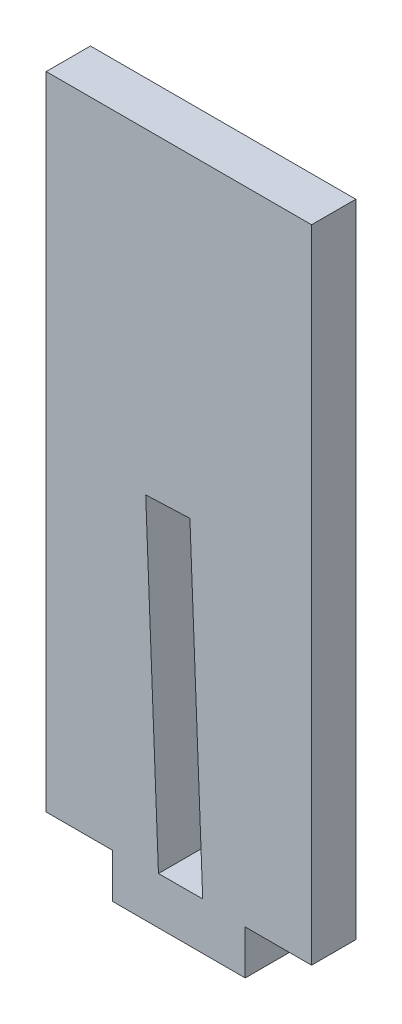
ISO-10303-21;
HEADER;
FILE_DESCRIPTION(('STEP AP214'),'2;1');
FILE_NAME('part.step','',(''),(''),'','','');
FILE_SCHEMA(('AUTOMOTIVE_DESIGN { 1 0 10303 214 1 1 1 1 }'));
ENDSEC;
DATA;
#1=APPLICATION_CONTEXT('core data for automotive mechanical design processes');
#2=APPLICATION_PROTOCOL_DEFINITION('international standard','automotive_design',2000,#1);
#3=PRODUCT_CONTEXT('',#1,'mechanical');
#4=PRODUCT('Part','Part','',(#3));
#5=PRODUCT_RELATED_PRODUCT_CATEGORY('part','',(#4));
#6=PRODUCT_DEFINITION_FORMATION('','',#4);
#7=PRODUCT_DEFINITION_CONTEXT('part definition',#1,'design');
#8=PRODUCT_DEFINITION('design','',#6,#7);
#9=PRODUCT_DEFINITION_SHAPE('','',#8);
#10=(LENGTH_UNIT() NAMED_UNIT(*) SI_UNIT(.MILLI.,.METRE.));
#11=(NAMED_UNIT(*) PLANE_ANGLE_UNIT() SI_UNIT($,.RADIAN.));
#12=(NAMED_UNIT(*) SI_UNIT($,.STERADIAN.) SOLID_ANGLE_UNIT());
#13=UNCERTAINTY_MEASURE_WITH_UNIT(LENGTH_MEASURE(1.E-05),#10,'distance_accuracy_value','');
#14=(GEOMETRIC_REPRESENTATION_CONTEXT(3) GLOBAL_UNCERTAINTY_ASSIGNED_CONTEXT((#13)) GLOBAL_UNIT_ASSIGNED_CONTEXT((#10,
#11,#12)) REPRESENTATION_CONTEXT('',''));
#15=CARTESIAN_POINT('',(0.,0.,0.));
#16=DIRECTION('',(0.,0.,1.));
#17=DIRECTION('',(1.,0.,0.));
#18=AXIS2_PLACEMENT_3D('',#15,#16,#17);
#19=CARTESIAN_POINT('',(-6.,0.,2.));
#20=DIRECTION('',(-1.,0.,0.));
#21=DIRECTION('',(0.,0.,1.));
#22=AXIS2_PLACEMENT_3D('',#19,#20,#21);
#23=PLANE('',#22);
#24=DIRECTION('',(0.,1.,0.));
#25=VECTOR('',#24,1.);
#26=CARTESIAN_POINT('',(-6.,15.,2.));
#27=LINE('',#26,#25);
#28=CARTESIAN_POINT('',(-6.,0.,2.));
#29=VERTEX_POINT('',#28);
#30=CARTESIAN_POINT('',(-6.,29.0000003609943,2.));
#31=VERTEX_POINT('',#30);
#32=EDGE_CURVE('E174',#29,#31,#27,.T.);
#33=ORIENTED_EDGE('',*,*,#32,.T.);
#34=DIRECTION('',(0.,0.,-1.));
#35=VECTOR('',#34,1.);
#36=CARTESIAN_POINT('',(-6.,29.0000003609943,2.));
#37=LINE('',#36,#35);
#38=CARTESIAN_POINT('',(-6.,29.0000003609943,0.));
#39=VERTEX_POINT('',#38);
#40=EDGE_CURVE('E170',#31,#39,#37,.T.);
#41=ORIENTED_EDGE('',*,*,#40,.T.);
#42=DIRECTION('',(0.,1.,0.));
#43=VECTOR('',#42,1.);
#44=CARTESIAN_POINT('',(-6.,0.,0.));
#45=LINE('',#44,#43);
#46=CARTESIAN_POINT('',(-6.,0.,0.));
#47=VERTEX_POINT('',#46);
#48=EDGE_CURVE('E178',#47,#39,#45,.T.);
#49=ORIENTED_EDGE('',*,*,#48,.F.);
#50=DIRECTION('',(0.,0.,-1.));
#51=VECTOR('',#50,1.);
#52=CARTESIAN_POINT('',(-6.,0.,2.));
#53=LINE('',#52,#51);
#54=EDGE_CURVE('E47',#29,#47,#53,.T.);
#55=ORIENTED_EDGE('',*,*,#54,.F.);
#56=EDGE_LOOP('',(#33,#41,#49,#55));
#57=FACE_BOUND('',#56,.T.);
#58=ADVANCED_FACE('F39',(#57),#23,.T.);
#59=CARTESIAN_POINT('',(6.,0.,2.));
#60=DIRECTION('',(-1.,0.,0.));
#61=DIRECTION('',(0.,0.,1.));
#62=AXIS2_PLACEMENT_3D('',#59,#60,#61);
#63=PLANE('',#62);
#64=DIRECTION('',(0.,0.,-1.));
#65=VECTOR('',#64,1.);
#66=CARTESIAN_POINT('',(6.,29.0000003609943,2.));
#67=LINE('',#66,#65);
#68=CARTESIAN_POINT('',(6.,29.0000003609943,2.));
#69=VERTEX_POINT('',#68);
#70=CARTESIAN_POINT('',(6.,29.0000003609943,0.));
#71=VERTEX_POINT('',#70);
#72=EDGE_CURVE('E168',#69,#71,#67,.T.);
#73=ORIENTED_EDGE('',*,*,#72,.F.);
#74=DIRECTION('',(0.,-1.,0.));
#75=VECTOR('',#74,1.);
#76=CARTESIAN_POINT('',(6.,30.0787744086171,2.));
#77=LINE('',#76,#75);
#78=CARTESIAN_POINT('',(6.,0.,2.));
#79=VERTEX_POINT('',#78);
#80=EDGE_CURVE('E177',#69,#79,#77,.T.);
#81=ORIENTED_EDGE('',*,*,#80,.T.);
#82=DIRECTION('',(0.,0.,-1.));
#83=VECTOR('',#82,1.);
#84=CARTESIAN_POINT('',(6.,0.,2.));
#85=LINE('',#84,#83);
#86=CARTESIAN_POINT('',(6.,0.,0.));
#87=VERTEX_POINT('',#86);
#88=EDGE_CURVE('E192',#79,#87,#85,.T.);
#89=ORIENTED_EDGE('',*,*,#88,.T.);
#90=DIRECTION('',(0.,1.,0.));
#91=VECTOR('',#90,1.);
#92=CARTESIAN_POINT('',(6.,0.,0.));
#93=LINE('',#92,#91);
#94=EDGE_CURVE('E173',#87,#71,#93,.T.);
#95=ORIENTED_EDGE('',*,*,#94,.T.);
#96=EDGE_LOOP('',(#73,#81,#89,#95));
#97=FACE_BOUND('',#96,.T.);
#98=ADVANCED_FACE('F41',(#97),#63,.F.);
#99=CARTESIAN_POINT('',(0.,0.,2.));
#100=DIRECTION('',(0.,0.,-1.));
#101=DIRECTION('',(-1.,0.,0.));
#102=AXIS2_PLACEMENT_3D('',#99,#100,#101);
#103=PLANE('',#102);
#104=DIRECTION('',(0.0395911000251429,-0.999215965043993,0.));
#105=VECTOR('',#104,1.);
#106=CARTESIAN_POINT('',(-0.924163415873446,0.129099689406868,2.));
#107=LINE('',#106,#105);
#108=CARTESIAN_POINT('',(-1.50033905111729,14.6708500585402,2.));
#109=VERTEX_POINT('',#108);
#110=CARTESIAN_POINT('',(-0.924163415873446,0.129099689406868,2.));
#111=VERTEX_POINT('',#110);
#112=EDGE_CURVE('E154',#109,#111,#107,.T.);
#113=ORIENTED_EDGE('',*,*,#112,.F.);
#114=DIRECTION('',(-0.999215965043994,-0.0395911000251419,0.));
#115=VECTOR('',#114,1.);
#116=CARTESIAN_POINT('',(0.498092878970701,14.7500322585905,2.));
#117=LINE('',#116,#115);
#118=CARTESIAN_POINT('',(0.498092878970701,14.7500322585905,2.));
#119=VERTEX_POINT('',#118);
#120=EDGE_CURVE('E54',#119,#109,#117,.T.);
#121=ORIENTED_EDGE('',*,*,#120,.F.);
#122=DIRECTION('',(-0.0395911000251416,0.999215965043993,0.));
#123=VECTOR('',#122,1.);
#124=CARTESIAN_POINT('',(1.07717743868844,0.134865293969887,2.));
#125=LINE('',#124,#123);
#126=CARTESIAN_POINT('',(1.07717743868844,0.134865293969887,2.));
#127=VERTEX_POINT('',#126);
#128=EDGE_CURVE('E158',#127,#119,#125,.T.);
#129=ORIENTED_EDGE('',*,*,#128,.F.);
#130=DIRECTION('',(0.999995850317353,0.00288085891238752,0.));
#131=VECTOR('',#130,1.);
#132=CARTESIAN_POINT('',(1.07717743868844,0.134865293969887,2.));
#133=LINE('',#132,#131);
#134=EDGE_CURVE('E130',#111,#127,#133,.T.);
#135=ORIENTED_EDGE('',*,*,#134,.F.);
#136=EDGE_LOOP('',(#113,#121,#129,#135));
#137=FACE_BOUND('',#136,.T.);
#138=DIRECTION('',(-1.,0.,0.));
#139=VECTOR('',#138,1.);
#140=CARTESIAN_POINT('',(0.,29.0000003609943,2.));
#141=LINE('',#140,#139);
#142=EDGE_CURVE('E163',#69,#31,#141,.T.);
#143=ORIENTED_EDGE('',*,*,#142,.T.);
#144=ORIENTED_EDGE('',*,*,#32,.F.);
#145=DIRECTION('',(1.,0.,0.));
#146=VECTOR('',#145,1.);
#147=CARTESIAN_POINT('',(-6.,0.,2.));
#148=LINE('',#147,#146);
#149=CARTESIAN_POINT('',(-3.,0.,2.));
#150=VERTEX_POINT('',#149);
#151=EDGE_CURVE('E190',#29,#150,#148,.T.);
#152=ORIENTED_EDGE('',*,*,#151,.T.);
#153=DIRECTION('',(0.,-1.,0.));
#154=VECTOR('',#153,1.);
#155=CARTESIAN_POINT('',(-3.,0.,2.));
#156=LINE('',#155,#154);
#157=CARTESIAN_POINT('',(-3.,-2.,2.));
#158=VERTEX_POINT('',#157);
#159=EDGE_CURVE('E188',#150,#158,#156,.T.);
#160=ORIENTED_EDGE('',*,*,#159,.T.);
#161=DIRECTION('',(1.,0.,0.));
#162=VECTOR('',#161,1.);
#163=CARTESIAN_POINT('',(-3.,-2.,2.));
#164=LINE('',#163,#162);
#165=CARTESIAN_POINT('',(3.,-2.,2.));
#166=VERTEX_POINT('',#165);
#167=EDGE_CURVE('E186',#158,#166,#164,.T.);
#168=ORIENTED_EDGE('',*,*,#167,.T.);
#169=DIRECTION('',(0.,-1.,0.));
#170=VECTOR('',#169,1.);
#171=CARTESIAN_POINT('',(3.,0.,2.));
#172=LINE('',#171,#170);
#173=CARTESIAN_POINT('',(3.,0.,2.));
#174=VERTEX_POINT('',#173);
#175=EDGE_CURVE('E183',#174,#166,#172,.T.);
#176=ORIENTED_EDGE('',*,*,#175,.F.);
#177=DIRECTION('',(1.,0.,0.));
#178=VECTOR('',#177,1.);
#179=CARTESIAN_POINT('',(3.,0.,2.));
#180=LINE('',#179,#178);
#181=EDGE_CURVE('E180',#174,#79,#180,.T.);
#182=ORIENTED_EDGE('',*,*,#181,.T.);
#183=ORIENTED_EDGE('',*,*,#80,.F.);
#184=EDGE_LOOP('',(#143,#144,#152,#160,#168,#176,#182,#183));
#185=FACE_BOUND('',#184,.T.);
#186=ADVANCED_FACE('F237',(#137,#185),#103,.F.);
#187=CARTESIAN_POINT('',(0.,0.,0.));
#188=DIRECTION('',(0.,0.,-1.));
#189=DIRECTION('',(-1.,0.,0.));
#190=AXIS2_PLACEMENT_3D('',#187,#188,#189);
#191=PLANE('',#190);
#192=DIRECTION('',(-0.999215965043994,-0.0395911000251419,0.));
#193=VECTOR('',#192,1.);
#194=CARTESIAN_POINT('',(0.498092878970701,14.7500322585905,0.));
#195=LINE('',#194,#193);
#196=CARTESIAN_POINT('',(0.498092878970701,14.7500322585905,0.));
#197=VERTEX_POINT('',#196);
#198=CARTESIAN_POINT('',(-1.50033905111729,14.6708500585402,0.));
#199=VERTEX_POINT('',#198);
#200=EDGE_CURVE('E143',#197,#199,#195,.T.);
#201=ORIENTED_EDGE('',*,*,#200,.T.);
#202=DIRECTION('',(0.0395911000251419,-0.999215965043993,0.));
#203=VECTOR('',#202,1.);
#204=CARTESIAN_POINT('',(-1.48819979584902,14.3644746948828,0.));
#205=LINE('',#204,#203);
#206=CARTESIAN_POINT('',(-0.924163415873446,0.129099689406868,0.));
#207=VERTEX_POINT('',#206);
#208=EDGE_CURVE('E149',#199,#207,#205,.T.);
#209=ORIENTED_EDGE('',*,*,#208,.T.);
#210=DIRECTION('',(0.999995850317353,0.00288085891238752,0.));
#211=VECTOR('',#210,1.);
#212=CARTESIAN_POINT('',(1.07717743868844,0.134865293969887,0.));
#213=LINE('',#212,#211);
#214=CARTESIAN_POINT('',(1.07717743868844,0.134865293969887,0.));
#215=VERTEX_POINT('',#214);
#216=EDGE_CURVE('E62',#207,#215,#213,.T.);
#217=ORIENTED_EDGE('',*,*,#216,.T.);
#218=DIRECTION('',(-0.0395911000251416,0.999215965043993,0.));
#219=VECTOR('',#218,1.);
#220=CARTESIAN_POINT('',(1.07717743868844,0.134865293969887,0.));
#221=LINE('',#220,#219);
#222=EDGE_CURVE('E138',#215,#197,#221,.T.);
#223=ORIENTED_EDGE('',*,*,#222,.T.);
#224=EDGE_LOOP('',(#201,#209,#217,#223));
#225=FACE_BOUND('',#224,.T.);
#226=ORIENTED_EDGE('',*,*,#48,.T.);
#227=DIRECTION('',(1.,0.,0.));
#228=VECTOR('',#227,1.);
#229=CARTESIAN_POINT('',(0.,29.0000003609943,0.));
#230=LINE('',#229,#228);
#231=EDGE_CURVE('E11',#39,#71,#230,.T.);
#232=ORIENTED_EDGE('',*,*,#231,.T.);
#233=ORIENTED_EDGE('',*,*,#94,.F.);
#234=DIRECTION('',(1.,0.,0.));
#235=VECTOR('',#234,1.);
#236=CARTESIAN_POINT('',(3.,0.,0.));
#237=LINE('',#236,#235);
#238=CARTESIAN_POINT('',(3.,0.,0.));
#239=VERTEX_POINT('',#238);
#240=EDGE_CURVE('E195',#239,#87,#237,.T.);
#241=ORIENTED_EDGE('',*,*,#240,.F.);
#242=DIRECTION('',(0.,-1.,0.));
#243=VECTOR('',#242,1.);
#244=CARTESIAN_POINT('',(3.,0.,0.));
#245=LINE('',#244,#243);
#246=CARTESIAN_POINT('',(3.,-2.,0.));
#247=VERTEX_POINT('',#246);
#248=EDGE_CURVE('E197',#239,#247,#245,.T.);
#249=ORIENTED_EDGE('',*,*,#248,.T.);
#250=DIRECTION('',(1.,0.,0.));
#251=VECTOR('',#250,1.);
#252=CARTESIAN_POINT('',(-3.,-2.,0.));
#253=LINE('',#252,#251);
#254=CARTESIAN_POINT('',(-3.,-2.,0.));
#255=VERTEX_POINT('',#254);
#256=EDGE_CURVE('E200',#255,#247,#253,.T.);
#257=ORIENTED_EDGE('',*,*,#256,.F.);
#258=DIRECTION('',(0.,-1.,0.));
#259=VECTOR('',#258,1.);
#260=CARTESIAN_POINT('',(-3.,0.,0.));
#261=LINE('',#260,#259);
#262=CARTESIAN_POINT('',(-3.,0.,0.));
#263=VERTEX_POINT('',#262);
#264=EDGE_CURVE('E203',#263,#255,#261,.T.);
#265=ORIENTED_EDGE('',*,*,#264,.F.);
#266=DIRECTION('',(1.,0.,0.));
#267=VECTOR('',#266,1.);
#268=CARTESIAN_POINT('',(-6.,0.,0.));
#269=LINE('',#268,#267);
#270=EDGE_CURVE('E205',#47,#263,#269,.T.);
#271=ORIENTED_EDGE('',*,*,#270,.F.);
#272=EDGE_LOOP('',(#226,#232,#233,#241,#249,#257,#265,#271));
#273=FACE_BOUND('',#272,.T.);
#274=ADVANCED_FACE('F146',(#225,#273),#191,.T.);
#275=CARTESIAN_POINT('',(-6.,0.,2.));
#276=DIRECTION('',(0.,1.,0.));
#277=DIRECTION('',(-1.,0.,0.));
#278=AXIS2_PLACEMENT_3D('',#275,#276,#277);
#279=PLANE('',#278);
#280=ORIENTED_EDGE('',*,*,#270,.T.);
#281=DIRECTION('',(0.,0.,-1.));
#282=VECTOR('',#281,1.);
#283=CARTESIAN_POINT('',(-3.,0.,2.));
#284=LINE('',#283,#282);
#285=EDGE_CURVE('E210',#150,#263,#284,.T.);
#286=ORIENTED_EDGE('',*,*,#285,.F.);
#287=ORIENTED_EDGE('',*,*,#151,.F.);
#288=ORIENTED_EDGE('',*,*,#54,.T.);
#289=EDGE_LOOP('',(#280,#286,#287,#288));
#290=FACE_BOUND('',#289,.T.);
#291=ADVANCED_FACE('F254',(#290),#279,.F.);
#292=CARTESIAN_POINT('',(-3.,0.,2.));
#293=DIRECTION('',(1.,0.,0.));
#294=DIRECTION('',(0.,1.,0.));
#295=AXIS2_PLACEMENT_3D('',#292,#293,#294);
#296=PLANE('',#295);
#297=ORIENTED_EDGE('',*,*,#264,.T.);
#298=DIRECTION('',(0.,0.,-1.));
#299=VECTOR('',#298,1.);
#300=CARTESIAN_POINT('',(-3.,-2.,2.));
#301=LINE('',#300,#299);
#302=EDGE_CURVE('E213',#158,#255,#301,.T.);
#303=ORIENTED_EDGE('',*,*,#302,.F.);
#304=ORIENTED_EDGE('',*,*,#159,.F.);
#305=ORIENTED_EDGE('',*,*,#285,.T.);
#306=EDGE_LOOP('',(#297,#303,#304,#305));
#307=FACE_BOUND('',#306,.T.);
#308=ADVANCED_FACE('F252',(#307),#296,.F.);
#309=CARTESIAN_POINT('',(-3.,-2.,2.));
#310=DIRECTION('',(0.,1.,0.));
#311=DIRECTION('',(-1.,0.,0.));
#312=AXIS2_PLACEMENT_3D('',#309,#310,#311);
#313=PLANE('',#312);
#314=ORIENTED_EDGE('',*,*,#256,.T.);
#315=DIRECTION('',(0.,0.,-1.));
#316=VECTOR('',#315,1.);
#317=CARTESIAN_POINT('',(3.,-2.,2.));
#318=LINE('',#317,#316);
#319=EDGE_CURVE('E216',#166,#247,#318,.T.);
#320=ORIENTED_EDGE('',*,*,#319,.F.);
#321=ORIENTED_EDGE('',*,*,#167,.F.);
#322=ORIENTED_EDGE('',*,*,#302,.T.);
#323=EDGE_LOOP('',(#314,#320,#321,#322));
#324=FACE_BOUND('',#323,.T.);
#325=ADVANCED_FACE('F247',(#324),#313,.F.);
#326=CARTESIAN_POINT('',(3.,0.,2.));
#327=DIRECTION('',(1.,0.,0.));
#328=DIRECTION('',(0.,0.,-1.));
#329=AXIS2_PLACEMENT_3D('',#326,#327,#328);
#330=PLANE('',#329);
#331=ORIENTED_EDGE('',*,*,#248,.F.);
#332=DIRECTION('',(0.,0.,-1.));
#333=VECTOR('',#332,1.);
#334=CARTESIAN_POINT('',(3.,0.,2.));
#335=LINE('',#334,#333);
#336=EDGE_CURVE('E218',#174,#239,#335,.T.);
#337=ORIENTED_EDGE('',*,*,#336,.F.);
#338=ORIENTED_EDGE('',*,*,#175,.T.);
#339=ORIENTED_EDGE('',*,*,#319,.T.);
#340=EDGE_LOOP('',(#331,#337,#338,#339));
#341=FACE_BOUND('',#340,.T.);
#342=ADVANCED_FACE('F242',(#341),#330,.T.);
#343=CARTESIAN_POINT('',(3.,0.,2.));
#344=DIRECTION('',(0.,1.,0.));
#345=DIRECTION('',(-1.,0.,0.));
#346=AXIS2_PLACEMENT_3D('',#343,#344,#345);
#347=PLANE('',#346);
#348=ORIENTED_EDGE('',*,*,#240,.T.);
#349=ORIENTED_EDGE('',*,*,#88,.F.);
#350=ORIENTED_EDGE('',*,*,#181,.F.);
#351=ORIENTED_EDGE('',*,*,#336,.T.);
#352=EDGE_LOOP('',(#348,#349,#350,#351));
#353=FACE_BOUND('',#352,.T.);
#354=ADVANCED_FACE('F240',(#353),#347,.F.);
#355=CARTESIAN_POINT('',(0.,29.0000003609943,-8.));
#356=DIRECTION('',(0.,1.,0.));
#357=DIRECTION('',(-1.,0.,0.));
#358=AXIS2_PLACEMENT_3D('',#355,#356,#357);
#359=PLANE('',#358);
#360=ORIENTED_EDGE('',*,*,#142,.F.);
#361=ORIENTED_EDGE('',*,*,#72,.T.);
#362=ORIENTED_EDGE('',*,*,#231,.F.);
#363=ORIENTED_EDGE('',*,*,#40,.F.);
#364=EDGE_LOOP('',(#360,#361,#362,#363));
#365=FACE_BOUND('',#364,.T.);
#366=ADVANCED_FACE('F232',(#365),#359,.T.);
#367=CARTESIAN_POINT('',(0.498092878970701,14.7500322585905,0.));
#368=DIRECTION('',(-0.0395911000251419,0.999215965043994,0.));
#369=DIRECTION('',(-0.999215965043993,-0.0395911000251419,0.));
#370=AXIS2_PLACEMENT_3D('',#367,#368,#369);
#371=PLANE('',#370);
#372=ORIENTED_EDGE('',*,*,#120,.T.);
#373=DIRECTION('',(0.,0.,1.));
#374=VECTOR('',#373,1.);
#375=CARTESIAN_POINT('',(-1.50033905111729,14.6708500585402,0.));
#376=LINE('',#375,#374);
#377=EDGE_CURVE('E161',#199,#109,#376,.T.);
#378=ORIENTED_EDGE('',*,*,#377,.F.);
#379=ORIENTED_EDGE('',*,*,#200,.F.);
#380=DIRECTION('',(0.,0.,1.));
#381=VECTOR('',#380,1.);
#382=CARTESIAN_POINT('',(0.498092878970701,14.7500322585905,0.));
#383=LINE('',#382,#381);
#384=EDGE_CURVE('E134',#197,#119,#383,.T.);
#385=ORIENTED_EDGE('',*,*,#384,.T.);
#386=EDGE_LOOP('',(#372,#378,#379,#385));
#387=FACE_BOUND('',#386,.T.);
#388=ADVANCED_FACE('F274',(#387),#371,.F.);
#389=CARTESIAN_POINT('',(1.07717743868844,0.134865293969887,0.));
#390=DIRECTION('',(0.999215965043994,0.0395911000251416,0.));
#391=DIRECTION('',(-0.0395911000251416,0.999215965043993,0.));
#392=AXIS2_PLACEMENT_3D('',#389,#390,#391);
#393=PLANE('',#392);
#394=ORIENTED_EDGE('',*,*,#128,.T.);
#395=ORIENTED_EDGE('',*,*,#384,.F.);
#396=ORIENTED_EDGE('',*,*,#222,.F.);
#397=DIRECTION('',(0.,0.,1.));
#398=VECTOR('',#397,1.);
#399=CARTESIAN_POINT('',(1.07717743868844,0.134865293969887,0.));
#400=LINE('',#399,#398);
#401=EDGE_CURVE('E126',#215,#127,#400,.T.);
#402=ORIENTED_EDGE('',*,*,#401,.T.);
#403=EDGE_LOOP('',(#394,#395,#396,#402));
#404=FACE_BOUND('',#403,.T.);
#405=ADVANCED_FACE('F139',(#404),#393,.F.);
#406=CARTESIAN_POINT('',(1.07717743868844,0.134865293969887,0.));
#407=DIRECTION('',(0.00288085891238752,-0.999995850317353,0.));
#408=DIRECTION('',(0.999995850317353,0.00288085891238752,0.));
#409=AXIS2_PLACEMENT_3D('',#406,#407,#408);
#410=PLANE('',#409);
#411=ORIENTED_EDGE('',*,*,#134,.T.);
#412=ORIENTED_EDGE('',*,*,#401,.F.);
#413=ORIENTED_EDGE('',*,*,#216,.F.);
#414=DIRECTION('',(0.,0.,1.));
#415=VECTOR('',#414,1.);
#416=CARTESIAN_POINT('',(-0.924163415873446,0.129099689406868,0.));
#417=LINE('',#416,#415);
#418=EDGE_CURVE('E135',#207,#111,#417,.T.);
#419=ORIENTED_EDGE('',*,*,#418,.T.);
#420=EDGE_LOOP('',(#411,#412,#413,#419));
#421=FACE_BOUND('',#420,.T.);
#422=ADVANCED_FACE('F128',(#421),#410,.F.);
#423=CARTESIAN_POINT('',(-0.924163415873446,0.129099689406868,0.));
#424=DIRECTION('',(-0.999215965043993,-0.0395911000251429,0.));
#425=DIRECTION('',(0.0395911000251429,-0.999215965043993,0.));
#426=AXIS2_PLACEMENT_3D('',#423,#424,#425);
#427=PLANE('',#426);
#428=ORIENTED_EDGE('',*,*,#112,.T.);
#429=ORIENTED_EDGE('',*,*,#418,.F.);
#430=ORIENTED_EDGE('',*,*,#208,.F.);
#431=ORIENTED_EDGE('',*,*,#377,.T.);
#432=EDGE_LOOP('',(#428,#429,#430,#431));
#433=FACE_BOUND('',#432,.T.);
#434=ADVANCED_FACE('F275',(#433),#427,.F.);
#435=CLOSED_SHELL('',(#58,#98,#186,#274,#291,#308,#325,#342,#354,#366,#388,#405,#422,#434));
#436=MANIFOLD_SOLID_BREP('B2',#435);
#437=ADVANCED_BREP_SHAPE_REPRESENTATION('',(#18,#436),#14);
#438=SHAPE_DEFINITION_REPRESENTATION(#9,#437);
ENDSEC;
END-ISO-10303-21;
